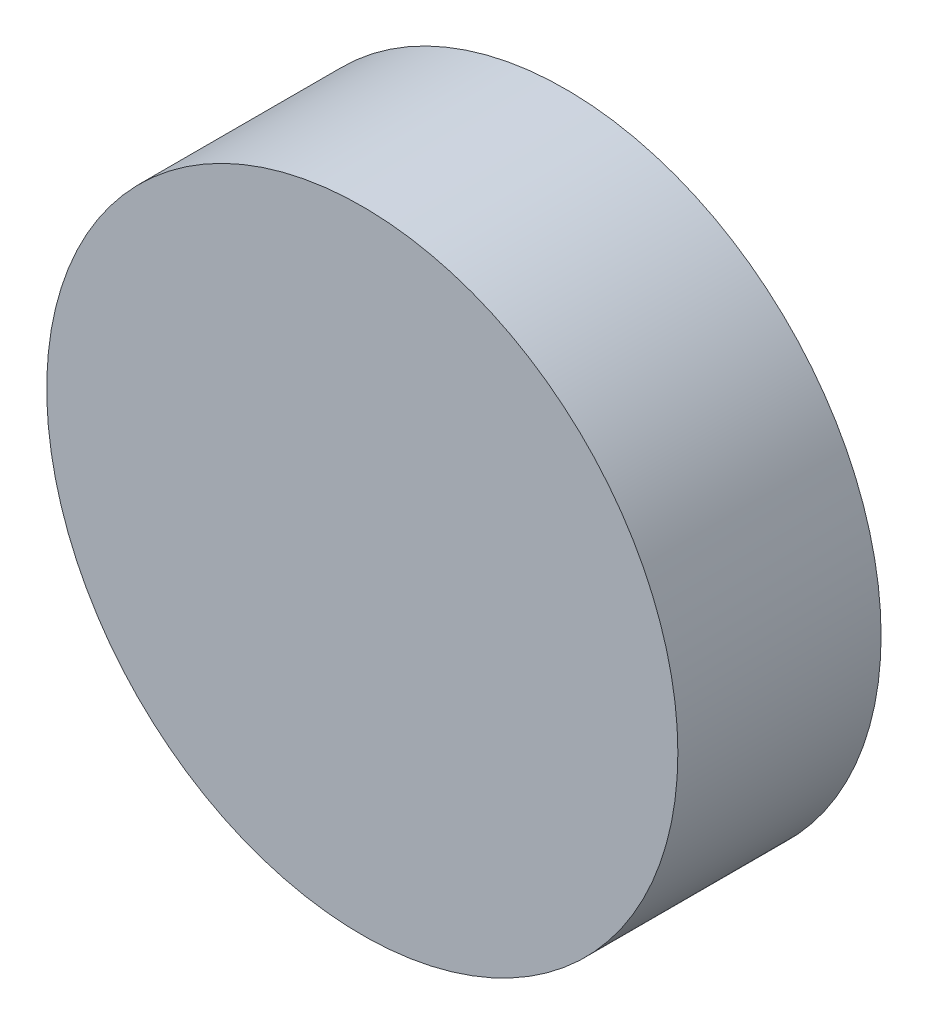
ISO-10303-21;
HEADER;
FILE_DESCRIPTION(('STEP AP214'),'2;1');
FILE_NAME('part.step','',(''),(''),'','','');
FILE_SCHEMA(('AUTOMOTIVE_DESIGN { 1 0 10303 214 1 1 1 1 }'));
ENDSEC;
DATA;
#1=APPLICATION_CONTEXT('core data for automotive mechanical design processes');
#2=APPLICATION_PROTOCOL_DEFINITION('international standard','automotive_design',2000,#1);
#3=PRODUCT_CONTEXT('',#1,'mechanical');
#4=PRODUCT('Part','Part','',(#3));
#5=PRODUCT_RELATED_PRODUCT_CATEGORY('part','',(#4));
#6=PRODUCT_DEFINITION_FORMATION('','',#4);
#7=PRODUCT_DEFINITION_CONTEXT('part definition',#1,'design');
#8=PRODUCT_DEFINITION('design','',#6,#7);
#9=PRODUCT_DEFINITION_SHAPE('','',#8);
#10=(LENGTH_UNIT() NAMED_UNIT(*) SI_UNIT(.MILLI.,.METRE.));
#11=(NAMED_UNIT(*) PLANE_ANGLE_UNIT() SI_UNIT($,.RADIAN.));
#12=(NAMED_UNIT(*) SI_UNIT($,.STERADIAN.) SOLID_ANGLE_UNIT());
#13=UNCERTAINTY_MEASURE_WITH_UNIT(LENGTH_MEASURE(1.E-05),#10,'distance_accuracy_value','');
#14=(GEOMETRIC_REPRESENTATION_CONTEXT(3) GLOBAL_UNCERTAINTY_ASSIGNED_CONTEXT((#13)) GLOBAL_UNIT_ASSIGNED_CONTEXT((#10,
#11,#12)) REPRESENTATION_CONTEXT('',''));
#15=CARTESIAN_POINT('',(0.,0.,0.));
#16=DIRECTION('',(0.,0.,1.));
#17=DIRECTION('',(1.,0.,0.));
#18=AXIS2_PLACEMENT_3D('',#15,#16,#17);
#19=CARTESIAN_POINT('',(0.,0.,-40.894));
#20=DIRECTION('',(0.,0.,1.));
#21=DIRECTION('',(1.,0.,0.));
#22=AXIS2_PLACEMENT_3D('',#19,#20,#21);
#23=CYLINDRICAL_SURFACE('',#22,63.5);
#24=CARTESIAN_POINT('',(0.,0.,-40.894));
#25=DIRECTION('',(0.,0.,1.));
#26=DIRECTION('',(1.,0.,0.));
#27=AXIS2_PLACEMENT_3D('',#24,#25,#26);
#28=CIRCLE('',#27,63.5);
#29=CARTESIAN_POINT('',(63.5,0.,-40.894));
#30=VERTEX_POINT('',#29);
#31=EDGE_CURVE('E10',#30,#30,#28,.T.);
#32=ORIENTED_EDGE('',*,*,#31,.T.);
#33=EDGE_LOOP('',(#32));
#34=FACE_BOUND('',#33,.T.);
#35=CARTESIAN_POINT('',(0.,0.,0.));
#36=DIRECTION('',(0.,0.,1.));
#37=DIRECTION('',(1.,0.,0.));
#38=AXIS2_PLACEMENT_3D('',#35,#36,#37);
#39=CIRCLE('',#38,63.5);
#40=CARTESIAN_POINT('',(63.5,0.,0.));
#41=VERTEX_POINT('',#40);
#42=EDGE_CURVE('E40',#41,#41,#39,.T.);
#43=ORIENTED_EDGE('',*,*,#42,.F.);
#44=EDGE_LOOP('',(#43));
#45=FACE_BOUND('',#44,.T.);
#46=ADVANCED_FACE('F37',(#34,#45),#23,.T.);
#47=CARTESIAN_POINT('',(0.,0.,-40.894));
#48=DIRECTION('',(0.,0.,1.));
#49=DIRECTION('',(1.,0.,0.));
#50=AXIS2_PLACEMENT_3D('',#47,#48,#49);
#51=PLANE('',#50);
#52=ORIENTED_EDGE('',*,*,#31,.F.);
#53=EDGE_LOOP('',(#52));
#54=FACE_BOUND('',#53,.T.);
#55=ADVANCED_FACE('F54',(#54),#51,.F.);
#56=CARTESIAN_POINT('',(0.,0.,0.));
#57=DIRECTION('',(0.,0.,1.));
#58=DIRECTION('',(1.,0.,0.));
#59=AXIS2_PLACEMENT_3D('',#56,#57,#58);
#60=PLANE('',#59);
#61=ORIENTED_EDGE('',*,*,#42,.T.);
#62=EDGE_LOOP('',(#61));
#63=FACE_BOUND('',#62,.T.);
#64=ADVANCED_FACE('F51',(#63),#60,.T.);
#65=CLOSED_SHELL('',(#46,#55,#64));
#66=MANIFOLD_SOLID_BREP('B2',#65);
#67=ADVANCED_BREP_SHAPE_REPRESENTATION('',(#18,#66),#14);
#68=SHAPE_DEFINITION_REPRESENTATION(#9,#67);
ENDSEC;
END-ISO-10303-21;
